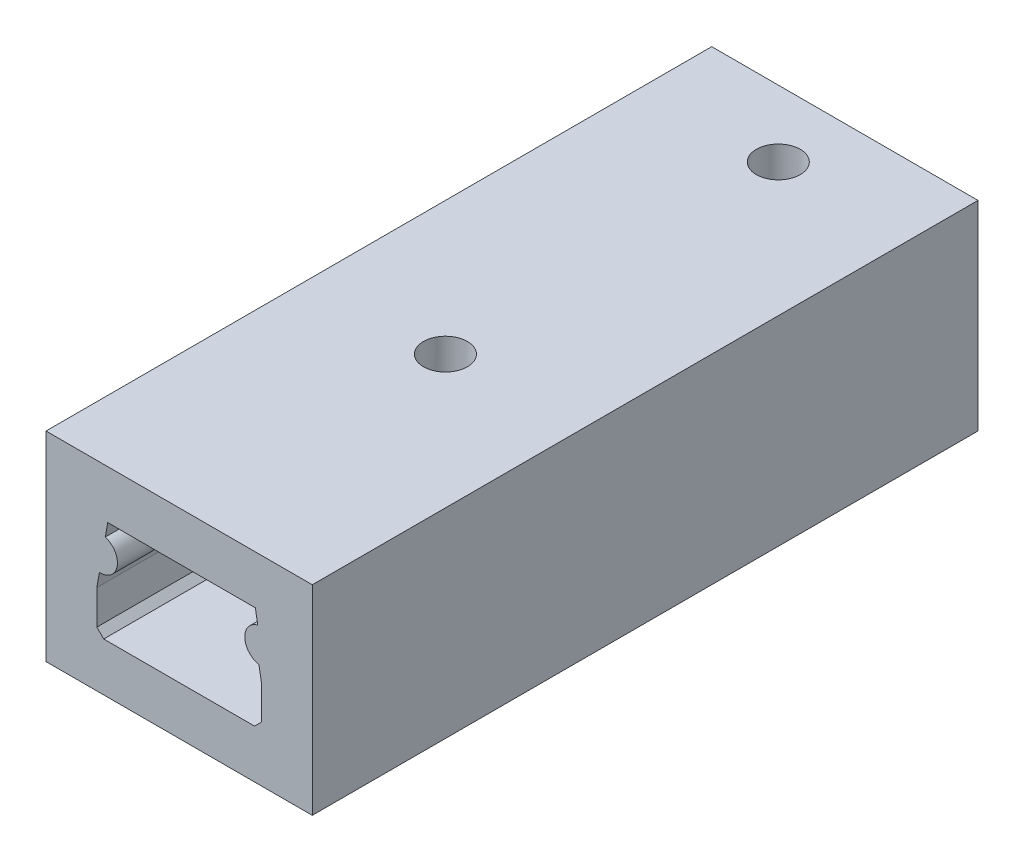
ISO-10303-21;
HEADER;
FILE_DESCRIPTION(('STEP AP214'),'2;1');
FILE_NAME('part.step','',(''),(''),'','','');
FILE_SCHEMA(('AUTOMOTIVE_DESIGN { 1 0 10303 214 1 1 1 1 }'));
ENDSEC;
DATA;
#1=APPLICATION_CONTEXT('core data for automotive mechanical design processes');
#2=APPLICATION_PROTOCOL_DEFINITION('international standard','automotive_design',2000,#1);
#3=PRODUCT_CONTEXT('',#1,'mechanical');
#4=PRODUCT('Part','Part','',(#3));
#5=PRODUCT_RELATED_PRODUCT_CATEGORY('part','',(#4));
#6=PRODUCT_DEFINITION_FORMATION('','',#4);
#7=PRODUCT_DEFINITION_CONTEXT('part definition',#1,'design');
#8=PRODUCT_DEFINITION('design','',#6,#7);
#9=PRODUCT_DEFINITION_SHAPE('','',#8);
#10=(LENGTH_UNIT() NAMED_UNIT(*) SI_UNIT(.MILLI.,.METRE.));
#11=(NAMED_UNIT(*) PLANE_ANGLE_UNIT() SI_UNIT($,.RADIAN.));
#12=(NAMED_UNIT(*) SI_UNIT($,.STERADIAN.) SOLID_ANGLE_UNIT());
#13=UNCERTAINTY_MEASURE_WITH_UNIT(LENGTH_MEASURE(1.E-05),#10,'distance_accuracy_value','');
#14=(GEOMETRIC_REPRESENTATION_CONTEXT(3) GLOBAL_UNCERTAINTY_ASSIGNED_CONTEXT((#13)) GLOBAL_UNIT_ASSIGNED_CONTEXT((#10,
#11,#12)) REPRESENTATION_CONTEXT('',''));
#15=CARTESIAN_POINT('',(0.,0.,0.));
#16=DIRECTION('',(0.,0.,1.));
#17=DIRECTION('',(1.,0.,0.));
#18=AXIS2_PLACEMENT_3D('',#15,#16,#17);
#19=CARTESIAN_POINT('',(0.,0.,50.));
#20=DIRECTION('',(0.,0.,-1.));
#21=DIRECTION('',(-1.,0.,0.));
#22=AXIS2_PLACEMENT_3D('',#19,#20,#21);
#23=PLANE('',#22);
#24=DIRECTION('',(0.,1.,0.));
#25=VECTOR('',#24,1.);
#26=CARTESIAN_POINT('',(10.,-3.75,50.));
#27=LINE('',#26,#25);
#28=CARTESIAN_POINT('',(10.,-3.75,50.));
#29=VERTEX_POINT('',#28);
#30=CARTESIAN_POINT('',(10.,11.25,50.));
#31=VERTEX_POINT('',#30);
#32=EDGE_CURVE('E292',#29,#31,#27,.T.);
#33=ORIENTED_EDGE('',*,*,#32,.T.);
#34=DIRECTION('',(-1.,0.,0.));
#35=VECTOR('',#34,1.);
#36=CARTESIAN_POINT('',(-10.,11.25,50.));
#37=LINE('',#36,#35);
#38=CARTESIAN_POINT('',(-10.,11.25,50.));
#39=VERTEX_POINT('',#38);
#40=EDGE_CURVE('E296',#31,#39,#37,.T.);
#41=ORIENTED_EDGE('',*,*,#40,.T.);
#42=DIRECTION('',(0.,-1.,0.));
#43=VECTOR('',#42,1.);
#44=CARTESIAN_POINT('',(-10.,-3.75,50.));
#45=LINE('',#44,#43);
#46=CARTESIAN_POINT('',(-10.,-3.75,50.));
#47=VERTEX_POINT('',#46);
#48=EDGE_CURVE('E300',#39,#47,#45,.T.);
#49=ORIENTED_EDGE('',*,*,#48,.T.);
#50=DIRECTION('',(1.,0.,0.));
#51=VECTOR('',#50,1.);
#52=CARTESIAN_POINT('',(-10.,-3.75,50.));
#53=LINE('',#52,#51);
#54=EDGE_CURVE('E303',#47,#29,#53,.T.);
#55=ORIENTED_EDGE('',*,*,#54,.T.);
#56=EDGE_LOOP('',(#33,#41,#49,#55));
#57=FACE_BOUND('',#56,.T.);
#58=DIRECTION('',(0.707106781186548,0.707106781186547,0.));
#59=VECTOR('',#58,1.);
#60=CARTESIAN_POINT('',(5.665,-0.1125,50.));
#61=LINE('',#60,#59);
#62=CARTESIAN_POINT('',(5.665,-0.1125,50.));
#63=VERTEX_POINT('',#62);
#64=CARTESIAN_POINT('',(6.18,0.4025,50.));
#65=VERTEX_POINT('',#64);
#66=EDGE_CURVE('E161',#63,#65,#61,.T.);
#67=ORIENTED_EDGE('',*,*,#66,.F.);
#68=DIRECTION('',(1.,0.,0.));
#69=VECTOR('',#68,1.);
#70=CARTESIAN_POINT('',(-5.665,-0.1125,50.));
#71=LINE('',#70,#69);
#72=CARTESIAN_POINT('',(-5.665,-0.1125,50.));
#73=VERTEX_POINT('',#72);
#74=EDGE_CURVE('E215',#73,#63,#71,.T.);
#75=ORIENTED_EDGE('',*,*,#74,.F.);
#76=DIRECTION('',(0.707106781186548,-0.707106781186547,0.));
#77=VECTOR('',#76,1.);
#78=CARTESIAN_POINT('',(-6.18,0.4025,50.));
#79=LINE('',#78,#77);
#80=CARTESIAN_POINT('',(-6.18,0.4025,50.));
#81=VERTEX_POINT('',#80);
#82=EDGE_CURVE('E212',#81,#73,#79,.T.);
#83=ORIENTED_EDGE('',*,*,#82,.F.);
#84=DIRECTION('',(0.,-1.,0.));
#85=VECTOR('',#84,1.);
#86=CARTESIAN_POINT('',(-6.18,2.9775,50.));
#87=LINE('',#86,#85);
#88=CARTESIAN_POINT('',(-6.18,2.9775,50.));
#89=VERTEX_POINT('',#88);
#90=EDGE_CURVE('E209',#89,#81,#87,.T.);
#91=ORIENTED_EDGE('',*,*,#90,.F.);
#92=DIRECTION('',(-0.173648177666919,-0.98480775301221,0.));
#93=VECTOR('',#92,1.);
#94=CARTESIAN_POINT('',(-5.98899935383237,4.0607184921458,50.));
#95=LINE('',#94,#93);
#96=CARTESIAN_POINT('',(-5.98899935383237,4.06071849214581,50.));
#97=VERTEX_POINT('',#96);
#98=EDGE_CURVE('E206',#97,#89,#95,.T.);
#99=ORIENTED_EDGE('',*,*,#98,.F.);
#100=CARTESIAN_POINT('',(-5.92249999999993,5.3465,50.));
#101=DIRECTION('',(0.,0.,-1.));
#102=DIRECTION('',(1.,0.,0.));
#103=AXIS2_PLACEMENT_3D('',#100,#101,#102);
#104=CIRCLE('',#103,1.28749999999997);
#105=CARTESIAN_POINT('',(-5.54522577648146,6.57748351340237,50.));
#106=VERTEX_POINT('',#105);
#107=EDGE_CURVE('E203',#106,#97,#104,.T.);
#108=ORIENTED_EDGE('',*,*,#107,.F.);
#109=DIRECTION('',(-0.17364817766689,-0.984807753012215,0.));
#110=VECTOR('',#109,1.);
#111=CARTESIAN_POINT('',(-5.36272444441626,7.6125,50.));
#112=LINE('',#111,#110);
#113=CARTESIAN_POINT('',(-5.36272444441626,7.6125,50.));
#114=VERTEX_POINT('',#113);
#115=EDGE_CURVE('E200',#114,#106,#112,.T.);
#116=ORIENTED_EDGE('',*,*,#115,.F.);
#117=DIRECTION('',(-1.,0.,0.));
#118=VECTOR('',#117,1.);
#119=CARTESIAN_POINT('',(5.72272444441626,7.6125,50.));
#120=LINE('',#119,#118);
#121=CARTESIAN_POINT('',(5.72272444441626,7.6125,50.));
#122=VERTEX_POINT('',#121);
#123=EDGE_CURVE('E197',#122,#114,#120,.T.);
#124=ORIENTED_EDGE('',*,*,#123,.F.);
#125=DIRECTION('',(-0.173648177666889,0.984807753012215,0.));
#126=VECTOR('',#125,1.);
#127=CARTESIAN_POINT('',(5.90522577648145,6.57748351340238,50.));
#128=LINE('',#127,#126);
#129=CARTESIAN_POINT('',(5.90522577648145,6.57748351340238,50.));
#130=VERTEX_POINT('',#129);
#131=EDGE_CURVE('E194',#130,#122,#128,.T.);
#132=ORIENTED_EDGE('',*,*,#131,.F.);
#133=CARTESIAN_POINT('',(6.21599005199749,5.32805091615556,50.));
#134=DIRECTION('',(0.,0.,-1.));
#135=DIRECTION('',(1.,0.,0.));
#136=AXIS2_PLACEMENT_3D('',#133,#134,#135);
#137=CIRCLE('',#136,1.28749999999998);
#138=CARTESIAN_POINT('',(5.98899935383237,4.06071849214579,50.));
#139=VERTEX_POINT('',#138);
#140=EDGE_CURVE('E188',#139,#130,#137,.T.);
#141=ORIENTED_EDGE('',*,*,#140,.F.);
#142=DIRECTION('',(-0.17364817766692,0.98480775301221,0.));
#143=VECTOR('',#142,1.);
#144=CARTESIAN_POINT('',(6.18,2.9775,50.));
#145=LINE('',#144,#143);
#146=CARTESIAN_POINT('',(6.18,2.9775,50.));
#147=VERTEX_POINT('',#146);
#148=EDGE_CURVE('E184',#147,#139,#145,.T.);
#149=ORIENTED_EDGE('',*,*,#148,.F.);
#150=DIRECTION('',(0.,1.,0.));
#151=VECTOR('',#150,1.);
#152=CARTESIAN_POINT('',(6.18,0.4025,50.));
#153=LINE('',#152,#151);
#154=EDGE_CURVE('E170',#65,#147,#153,.T.);
#155=ORIENTED_EDGE('',*,*,#154,.F.);
#156=EDGE_LOOP('',(#67,#75,#83,#91,#99,#108,#116,#124,#132,#141,#149,#155));
#157=FACE_BOUND('',#156,.T.);
#158=ADVANCED_FACE('F45',(#57,#157),#23,.F.);
#159=CARTESIAN_POINT('',(0.,0.,0.));
#160=DIRECTION('',(0.,0.,-1.));
#161=DIRECTION('',(-1.,0.,0.));
#162=AXIS2_PLACEMENT_3D('',#159,#160,#161);
#163=PLANE('',#162);
#164=DIRECTION('',(0.,1.,0.));
#165=VECTOR('',#164,1.);
#166=CARTESIAN_POINT('',(10.,-3.75,0.));
#167=LINE('',#166,#165);
#168=CARTESIAN_POINT('',(10.,-3.75,0.));
#169=VERTEX_POINT('',#168);
#170=CARTESIAN_POINT('',(10.,11.25,0.));
#171=VERTEX_POINT('',#170);
#172=EDGE_CURVE('E179',#169,#171,#167,.T.);
#173=ORIENTED_EDGE('',*,*,#172,.F.);
#174=DIRECTION('',(1.,0.,0.));
#175=VECTOR('',#174,1.);
#176=CARTESIAN_POINT('',(-10.,-3.75,0.));
#177=LINE('',#176,#175);
#178=CARTESIAN_POINT('',(-10.,-3.75,0.));
#179=VERTEX_POINT('',#178);
#180=EDGE_CURVE('E297',#179,#169,#177,.T.);
#181=ORIENTED_EDGE('',*,*,#180,.F.);
#182=DIRECTION('',(0.,-1.,0.));
#183=VECTOR('',#182,1.);
#184=CARTESIAN_POINT('',(-10.,-3.75,0.));
#185=LINE('',#184,#183);
#186=CARTESIAN_POINT('',(-10.,11.25,0.));
#187=VERTEX_POINT('',#186);
#188=EDGE_CURVE('E313',#187,#179,#185,.T.);
#189=ORIENTED_EDGE('',*,*,#188,.F.);
#190=DIRECTION('',(-1.,0.,0.));
#191=VECTOR('',#190,1.);
#192=CARTESIAN_POINT('',(-10.,11.25,0.));
#193=LINE('',#192,#191);
#194=EDGE_CURVE('E310',#171,#187,#193,.T.);
#195=ORIENTED_EDGE('',*,*,#194,.F.);
#196=EDGE_LOOP('',(#173,#181,#189,#195));
#197=FACE_BOUND('',#196,.T.);
#198=DIRECTION('',(1.,0.,0.));
#199=VECTOR('',#198,1.);
#200=CARTESIAN_POINT('',(-5.665,-0.1125,0.));
#201=LINE('',#200,#199);
#202=CARTESIAN_POINT('',(-5.665,-0.1125,0.));
#203=VERTEX_POINT('',#202);
#204=CARTESIAN_POINT('',(5.665,-0.1125,0.));
#205=VERTEX_POINT('',#204);
#206=EDGE_CURVE('E171',#203,#205,#201,.T.);
#207=ORIENTED_EDGE('',*,*,#206,.T.);
#208=DIRECTION('',(0.707106781186548,0.707106781186547,0.));
#209=VECTOR('',#208,1.);
#210=CARTESIAN_POINT('',(5.665,-0.1125,0.));
#211=LINE('',#210,#209);
#212=CARTESIAN_POINT('',(6.18,0.4025,0.));
#213=VERTEX_POINT('',#212);
#214=EDGE_CURVE('E71',#205,#213,#211,.T.);
#215=ORIENTED_EDGE('',*,*,#214,.T.);
#216=DIRECTION('',(0.,1.,0.));
#217=VECTOR('',#216,1.);
#218=CARTESIAN_POINT('',(6.18,0.4025,0.));
#219=LINE('',#218,#217);
#220=CARTESIAN_POINT('',(6.18,2.9775,0.));
#221=VERTEX_POINT('',#220);
#222=EDGE_CURVE('E177',#213,#221,#219,.T.);
#223=ORIENTED_EDGE('',*,*,#222,.T.);
#224=DIRECTION('',(-0.17364817766692,0.98480775301221,0.));
#225=VECTOR('',#224,1.);
#226=CARTESIAN_POINT('',(6.18,2.9775,0.));
#227=LINE('',#226,#225);
#228=CARTESIAN_POINT('',(5.98899935383237,4.06071849214579,0.));
#229=VERTEX_POINT('',#228);
#230=EDGE_CURVE('E223',#221,#229,#227,.T.);
#231=ORIENTED_EDGE('',*,*,#230,.T.);
#232=CARTESIAN_POINT('',(6.21599005199749,5.32805091615556,0.));
#233=DIRECTION('',(0.,0.,-1.));
#234=DIRECTION('',(1.,0.,0.));
#235=AXIS2_PLACEMENT_3D('',#232,#233,#234);
#236=CIRCLE('',#235,1.28749999999998);
#237=CARTESIAN_POINT('',(5.90522577648145,6.57748351340238,0.));
#238=VERTEX_POINT('',#237);
#239=EDGE_CURVE('E227',#229,#238,#236,.T.);
#240=ORIENTED_EDGE('',*,*,#239,.T.);
#241=DIRECTION('',(-0.173648177666889,0.984807753012215,0.));
#242=VECTOR('',#241,1.);
#243=CARTESIAN_POINT('',(5.90522577648145,6.57748351340238,0.));
#244=LINE('',#243,#242);
#245=CARTESIAN_POINT('',(5.72272444441626,7.6125,0.));
#246=VERTEX_POINT('',#245);
#247=EDGE_CURVE('E231',#238,#246,#244,.T.);
#248=ORIENTED_EDGE('',*,*,#247,.T.);
#249=DIRECTION('',(-1.,0.,0.));
#250=VECTOR('',#249,1.);
#251=CARTESIAN_POINT('',(5.72272444441626,7.6125,0.));
#252=LINE('',#251,#250);
#253=CARTESIAN_POINT('',(-5.36272444441626,7.6125,0.));
#254=VERTEX_POINT('',#253);
#255=EDGE_CURVE('E235',#246,#254,#252,.T.);
#256=ORIENTED_EDGE('',*,*,#255,.T.);
#257=DIRECTION('',(-0.17364817766689,-0.984807753012215,0.));
#258=VECTOR('',#257,1.);
#259=CARTESIAN_POINT('',(-5.36272444441626,7.6125,0.));
#260=LINE('',#259,#258);
#261=CARTESIAN_POINT('',(-5.54522577648146,6.57748351340237,0.));
#262=VERTEX_POINT('',#261);
#263=EDGE_CURVE('E239',#254,#262,#260,.T.);
#264=ORIENTED_EDGE('',*,*,#263,.T.);
#265=CARTESIAN_POINT('',(-5.92249999999993,5.3465,0.));
#266=DIRECTION('',(0.,0.,-1.));
#267=DIRECTION('',(1.,0.,0.));
#268=AXIS2_PLACEMENT_3D('',#265,#266,#267);
#269=CIRCLE('',#268,1.28749999999997);
#270=CARTESIAN_POINT('',(-5.98899935383237,4.06071849214581,0.));
#271=VERTEX_POINT('',#270);
#272=EDGE_CURVE('E243',#262,#271,#269,.T.);
#273=ORIENTED_EDGE('',*,*,#272,.T.);
#274=DIRECTION('',(-0.173648177666919,-0.98480775301221,0.));
#275=VECTOR('',#274,1.);
#276=CARTESIAN_POINT('',(-5.98899935383237,4.0607184921458,0.));
#277=LINE('',#276,#275);
#278=CARTESIAN_POINT('',(-6.18,2.9775,0.));
#279=VERTEX_POINT('',#278);
#280=EDGE_CURVE('E247',#271,#279,#277,.T.);
#281=ORIENTED_EDGE('',*,*,#280,.T.);
#282=DIRECTION('',(0.,-1.,0.));
#283=VECTOR('',#282,1.);
#284=CARTESIAN_POINT('',(-6.18,2.9775,0.));
#285=LINE('',#284,#283);
#286=CARTESIAN_POINT('',(-6.18,0.4025,0.));
#287=VERTEX_POINT('',#286);
#288=EDGE_CURVE('E251',#279,#287,#285,.T.);
#289=ORIENTED_EDGE('',*,*,#288,.T.);
#290=DIRECTION('',(0.707106781186548,-0.707106781186547,0.));
#291=VECTOR('',#290,1.);
#292=CARTESIAN_POINT('',(-6.18,0.4025,0.));
#293=LINE('',#292,#291);
#294=EDGE_CURVE('E255',#287,#203,#293,.T.);
#295=ORIENTED_EDGE('',*,*,#294,.T.);
#296=EDGE_LOOP('',(#207,#215,#223,#231,#240,#248,#256,#264,#273,#281,#289,#295));
#297=FACE_BOUND('',#296,.T.);
#298=ADVANCED_FACE('F373',(#197,#297),#163,.T.);
#299=CARTESIAN_POINT('',(10.,-3.75,50.));
#300=DIRECTION('',(-1.,0.,0.));
#301=DIRECTION('',(0.,0.,1.));
#302=AXIS2_PLACEMENT_3D('',#299,#300,#301);
#303=PLANE('',#302);
#304=ORIENTED_EDGE('',*,*,#172,.T.);
#305=DIRECTION('',(0.,0.,-1.));
#306=VECTOR('',#305,1.);
#307=CARTESIAN_POINT('',(10.,11.25,50.));
#308=LINE('',#307,#306);
#309=EDGE_CURVE('E11',#31,#171,#308,.T.);
#310=ORIENTED_EDGE('',*,*,#309,.F.);
#311=ORIENTED_EDGE('',*,*,#32,.F.);
#312=DIRECTION('',(0.,0.,-1.));
#313=VECTOR('',#312,1.);
#314=CARTESIAN_POINT('',(10.,-3.75,50.));
#315=LINE('',#314,#313);
#316=EDGE_CURVE('E306',#29,#169,#315,.T.);
#317=ORIENTED_EDGE('',*,*,#316,.T.);
#318=EDGE_LOOP('',(#304,#310,#311,#317));
#319=FACE_BOUND('',#318,.T.);
#320=ADVANCED_FACE('F47',(#319),#303,.F.);
#321=CARTESIAN_POINT('',(-10.,11.25,50.));
#322=DIRECTION('',(0.,-1.,0.));
#323=DIRECTION('',(0.,0.,-1.));
#324=AXIS2_PLACEMENT_3D('',#321,#322,#323);
#325=PLANE('',#324);
#326=CARTESIAN_POINT('',(0.,11.25,5.));
#327=DIRECTION('',(0.,1.,0.));
#328=DIRECTION('',(0.,0.,1.));
#329=AXIS2_PLACEMENT_3D('',#326,#327,#328);
#330=CIRCLE('',#329,1.65);
#331=CARTESIAN_POINT('',(0.,11.25,6.65));
#332=VERTEX_POINT('',#331);
#333=EDGE_CURVE('E339',#332,#332,#330,.T.);
#334=ORIENTED_EDGE('',*,*,#333,.F.);
#335=EDGE_LOOP('',(#334));
#336=FACE_BOUND('',#335,.T.);
#337=CARTESIAN_POINT('',(0.,11.25,30.));
#338=DIRECTION('',(0.,1.,0.));
#339=DIRECTION('',(0.,0.,1.));
#340=AXIS2_PLACEMENT_3D('',#337,#338,#339);
#341=CIRCLE('',#340,1.65);
#342=CARTESIAN_POINT('',(0.,11.25,31.65));
#343=VERTEX_POINT('',#342);
#344=EDGE_CURVE('E345',#343,#343,#341,.T.);
#345=ORIENTED_EDGE('',*,*,#344,.F.);
#346=EDGE_LOOP('',(#345));
#347=FACE_BOUND('',#346,.T.);
#348=ORIENTED_EDGE('',*,*,#194,.T.);
#349=DIRECTION('',(0.,0.,-1.));
#350=VECTOR('',#349,1.);
#351=CARTESIAN_POINT('',(-10.,11.25,50.));
#352=LINE('',#351,#350);
#353=EDGE_CURVE('E55',#39,#187,#352,.T.);
#354=ORIENTED_EDGE('',*,*,#353,.F.);
#355=ORIENTED_EDGE('',*,*,#40,.F.);
#356=ORIENTED_EDGE('',*,*,#309,.T.);
#357=EDGE_LOOP('',(#348,#354,#355,#356));
#358=FACE_BOUND('',#357,.T.);
#359=ADVANCED_FACE('F437',(#336,#347,#358),#325,.F.);
#360=CARTESIAN_POINT('',(-10.,-3.75,50.));
#361=DIRECTION('',(1.,0.,0.));
#362=DIRECTION('',(0.,0.,-1.));
#363=AXIS2_PLACEMENT_3D('',#360,#361,#362);
#364=PLANE('',#363);
#365=ORIENTED_EDGE('',*,*,#188,.T.);
#366=DIRECTION('',(0.,0.,-1.));
#367=VECTOR('',#366,1.);
#368=CARTESIAN_POINT('',(-10.,-3.75,50.));
#369=LINE('',#368,#367);
#370=EDGE_CURVE('E321',#47,#179,#369,.T.);
#371=ORIENTED_EDGE('',*,*,#370,.F.);
#372=ORIENTED_EDGE('',*,*,#48,.F.);
#373=ORIENTED_EDGE('',*,*,#353,.T.);
#374=EDGE_LOOP('',(#365,#371,#372,#373));
#375=FACE_BOUND('',#374,.T.);
#376=ADVANCED_FACE('F435',(#375),#364,.F.);
#377=CARTESIAN_POINT('',(-10.,-3.75,50.));
#378=DIRECTION('',(0.,1.,0.));
#379=DIRECTION('',(0.,0.,1.));
#380=AXIS2_PLACEMENT_3D('',#377,#378,#379);
#381=PLANE('',#380);
#382=CARTESIAN_POINT('',(0.,-3.75,5.));
#383=DIRECTION('',(0.,1.,0.));
#384=DIRECTION('',(0.,0.,1.));
#385=AXIS2_PLACEMENT_3D('',#382,#383,#384);
#386=CIRCLE('',#385,1.65);
#387=CARTESIAN_POINT('',(0.,-3.75,6.65));
#388=VERTEX_POINT('',#387);
#389=EDGE_CURVE('E331',#388,#388,#386,.T.);
#390=ORIENTED_EDGE('',*,*,#389,.T.);
#391=EDGE_LOOP('',(#390));
#392=FACE_BOUND('',#391,.T.);
#393=CARTESIAN_POINT('',(0.,-3.75,30.));
#394=DIRECTION('',(0.,1.,0.));
#395=DIRECTION('',(0.,0.,1.));
#396=AXIS2_PLACEMENT_3D('',#393,#394,#395);
#397=CIRCLE('',#396,1.65);
#398=CARTESIAN_POINT('',(0.,-3.75,31.65));
#399=VERTEX_POINT('',#398);
#400=EDGE_CURVE('E351',#399,#399,#397,.T.);
#401=ORIENTED_EDGE('',*,*,#400,.T.);
#402=EDGE_LOOP('',(#401));
#403=FACE_BOUND('',#402,.T.);
#404=ORIENTED_EDGE('',*,*,#180,.T.);
#405=ORIENTED_EDGE('',*,*,#316,.F.);
#406=ORIENTED_EDGE('',*,*,#54,.F.);
#407=ORIENTED_EDGE('',*,*,#370,.T.);
#408=EDGE_LOOP('',(#404,#405,#406,#407));
#409=FACE_BOUND('',#408,.T.);
#410=ADVANCED_FACE('F432',(#392,#403,#409),#381,.F.);
#411=CARTESIAN_POINT('',(5.665,-0.1125,50.));
#412=DIRECTION('',(-0.707106781186547,0.707106781186548,0.));
#413=DIRECTION('',(-0.707106781186548,-0.707106781186547,0.));
#414=AXIS2_PLACEMENT_3D('',#411,#412,#413);
#415=PLANE('',#414);
#416=ORIENTED_EDGE('',*,*,#214,.F.);
#417=DIRECTION('',(0.,0.,-1.));
#418=VECTOR('',#417,1.);
#419=CARTESIAN_POINT('',(5.665,-0.1125,50.));
#420=LINE('',#419,#418);
#421=EDGE_CURVE('E165',#63,#205,#420,.T.);
#422=ORIENTED_EDGE('',*,*,#421,.F.);
#423=ORIENTED_EDGE('',*,*,#66,.T.);
#424=DIRECTION('',(0.,0.,-1.));
#425=VECTOR('',#424,1.);
#426=CARTESIAN_POINT('',(6.18,0.4025,50.));
#427=LINE('',#426,#425);
#428=EDGE_CURVE('E164',#65,#213,#427,.T.);
#429=ORIENTED_EDGE('',*,*,#428,.T.);
#430=EDGE_LOOP('',(#416,#422,#423,#429));
#431=FACE_BOUND('',#430,.T.);
#432=ADVANCED_FACE('F163',(#431),#415,.T.);
#433=CARTESIAN_POINT('',(6.18,0.4025,50.));
#434=DIRECTION('',(-1.,0.,0.));
#435=DIRECTION('',(0.,0.,1.));
#436=AXIS2_PLACEMENT_3D('',#433,#434,#435);
#437=PLANE('',#436);
#438=ORIENTED_EDGE('',*,*,#222,.F.);
#439=ORIENTED_EDGE('',*,*,#428,.F.);
#440=ORIENTED_EDGE('',*,*,#154,.T.);
#441=DIRECTION('',(0.,0.,-1.));
#442=VECTOR('',#441,1.);
#443=CARTESIAN_POINT('',(6.18,2.9775,50.));
#444=LINE('',#443,#442);
#445=EDGE_CURVE('E180',#147,#221,#444,.T.);
#446=ORIENTED_EDGE('',*,*,#445,.T.);
#447=EDGE_LOOP('',(#438,#439,#440,#446));
#448=FACE_BOUND('',#447,.T.);
#449=ADVANCED_FACE('F174',(#448),#437,.T.);
#450=CARTESIAN_POINT('',(6.18,2.9775,50.));
#451=DIRECTION('',(-0.98480775301221,-0.17364817766692,0.));
#452=DIRECTION('',(0.17364817766692,-0.98480775301221,0.));
#453=AXIS2_PLACEMENT_3D('',#450,#451,#452);
#454=PLANE('',#453);
#455=ORIENTED_EDGE('',*,*,#230,.F.);
#456=ORIENTED_EDGE('',*,*,#445,.F.);
#457=ORIENTED_EDGE('',*,*,#148,.T.);
#458=DIRECTION('',(0.,0.,-1.));
#459=VECTOR('',#458,1.);
#460=CARTESIAN_POINT('',(5.98899935383237,4.06071849214579,50.));
#461=LINE('',#460,#459);
#462=EDGE_CURVE('E287',#139,#229,#461,.T.);
#463=ORIENTED_EDGE('',*,*,#462,.T.);
#464=EDGE_LOOP('',(#455,#456,#457,#463));
#465=FACE_BOUND('',#464,.T.);
#466=ADVANCED_FACE('F413',(#465),#454,.T.);
#467=CARTESIAN_POINT('',(6.21599005199749,5.32805091615556,50.));
#468=DIRECTION('',(0.,0.,-1.));
#469=DIRECTION('',(-1.,0.,0.));
#470=AXIS2_PLACEMENT_3D('',#467,#468,#469);
#471=CYLINDRICAL_SURFACE('',#470,1.28749999999998);
#472=ORIENTED_EDGE('',*,*,#239,.F.);
#473=ORIENTED_EDGE('',*,*,#462,.F.);
#474=ORIENTED_EDGE('',*,*,#140,.T.);
#475=DIRECTION('',(0.,0.,-1.));
#476=VECTOR('',#475,1.);
#477=CARTESIAN_POINT('',(5.90522577648145,6.57748351340238,50.));
#478=LINE('',#477,#476);
#479=EDGE_CURVE('E284',#130,#238,#478,.T.);
#480=ORIENTED_EDGE('',*,*,#479,.T.);
#481=EDGE_LOOP('',(#472,#473,#474,#480));
#482=FACE_BOUND('',#481,.T.);
#483=ADVANCED_FACE('F410',(#482),#471,.T.);
#484=CARTESIAN_POINT('',(5.90522577648145,6.57748351340238,50.));
#485=DIRECTION('',(-0.984807753012215,-0.173648177666889,0.));
#486=DIRECTION('',(0.173648177666889,-0.984807753012215,0.));
#487=AXIS2_PLACEMENT_3D('',#484,#485,#486);
#488=PLANE('',#487);
#489=ORIENTED_EDGE('',*,*,#247,.F.);
#490=ORIENTED_EDGE('',*,*,#479,.F.);
#491=ORIENTED_EDGE('',*,*,#131,.T.);
#492=DIRECTION('',(0.,0.,-1.));
#493=VECTOR('',#492,1.);
#494=CARTESIAN_POINT('',(5.72272444441626,7.6125,50.));
#495=LINE('',#494,#493);
#496=EDGE_CURVE('E281',#122,#246,#495,.T.);
#497=ORIENTED_EDGE('',*,*,#496,.T.);
#498=EDGE_LOOP('',(#489,#490,#491,#497));
#499=FACE_BOUND('',#498,.T.);
#500=ADVANCED_FACE('F405',(#499),#488,.T.);
#501=CARTESIAN_POINT('',(5.72272444441626,7.6125,50.));
#502=DIRECTION('',(0.,-1.,0.));
#503=DIRECTION('',(0.,0.,-1.));
#504=AXIS2_PLACEMENT_3D('',#501,#502,#503);
#505=PLANE('',#504);
#506=CARTESIAN_POINT('',(0.,7.6125,5.));
#507=DIRECTION('',(0.,-1.,0.));
#508=DIRECTION('',(0.,0.,-1.));
#509=AXIS2_PLACEMENT_3D('',#506,#507,#508);
#510=CIRCLE('',#509,1.65);
#511=CARTESIAN_POINT('',(0.,7.6125,3.35));
#512=VERTEX_POINT('',#511);
#513=EDGE_CURVE('E220',#512,#512,#510,.T.);
#514=ORIENTED_EDGE('',*,*,#513,.F.);
#515=EDGE_LOOP('',(#514));
#516=FACE_BOUND('',#515,.T.);
#517=CARTESIAN_POINT('',(0.,7.6125,30.));
#518=DIRECTION('',(0.,-1.,0.));
#519=DIRECTION('',(0.,0.,-1.));
#520=AXIS2_PLACEMENT_3D('',#517,#518,#519);
#521=CIRCLE('',#520,1.65);
#522=CARTESIAN_POINT('',(0.,7.6125,28.35));
#523=VERTEX_POINT('',#522);
#524=EDGE_CURVE('E330',#523,#523,#521,.T.);
#525=ORIENTED_EDGE('',*,*,#524,.F.);
#526=EDGE_LOOP('',(#525));
#527=FACE_BOUND('',#526,.T.);
#528=ORIENTED_EDGE('',*,*,#255,.F.);
#529=ORIENTED_EDGE('',*,*,#496,.F.);
#530=ORIENTED_EDGE('',*,*,#123,.T.);
#531=DIRECTION('',(0.,0.,-1.));
#532=VECTOR('',#531,1.);
#533=CARTESIAN_POINT('',(-5.36272444441626,7.6125,50.));
#534=LINE('',#533,#532);
#535=EDGE_CURVE('E278',#114,#254,#534,.T.);
#536=ORIENTED_EDGE('',*,*,#535,.T.);
#537=EDGE_LOOP('',(#528,#529,#530,#536));
#538=FACE_BOUND('',#537,.T.);
#539=ADVANCED_FACE('F401',(#516,#527,#538),#505,.T.);
#540=CARTESIAN_POINT('',(-5.36272444441626,7.6125,50.));
#541=DIRECTION('',(0.984807753012215,-0.17364817766689,0.));
#542=DIRECTION('',(0.17364817766689,0.984807753012215,0.));
#543=AXIS2_PLACEMENT_3D('',#540,#541,#542);
#544=PLANE('',#543);
#545=ORIENTED_EDGE('',*,*,#263,.F.);
#546=ORIENTED_EDGE('',*,*,#535,.F.);
#547=ORIENTED_EDGE('',*,*,#115,.T.);
#548=DIRECTION('',(0.,0.,-1.));
#549=VECTOR('',#548,1.);
#550=CARTESIAN_POINT('',(-5.54522577648146,6.57748351340237,50.));
#551=LINE('',#550,#549);
#552=EDGE_CURVE('E275',#106,#262,#551,.T.);
#553=ORIENTED_EDGE('',*,*,#552,.T.);
#554=EDGE_LOOP('',(#545,#546,#547,#553));
#555=FACE_BOUND('',#554,.T.);
#556=ADVANCED_FACE('F398',(#555),#544,.T.);
#557=CARTESIAN_POINT('',(-5.92249999999993,5.3465,50.));
#558=DIRECTION('',(0.,0.,-1.));
#559=DIRECTION('',(-1.,0.,0.));
#560=AXIS2_PLACEMENT_3D('',#557,#558,#559);
#561=CYLINDRICAL_SURFACE('',#560,1.28749999999997);
#562=ORIENTED_EDGE('',*,*,#272,.F.);
#563=ORIENTED_EDGE('',*,*,#552,.F.);
#564=ORIENTED_EDGE('',*,*,#107,.T.);
#565=DIRECTION('',(0.,0.,-1.));
#566=VECTOR('',#565,1.);
#567=CARTESIAN_POINT('',(-5.98899935383237,4.06071849214581,50.));
#568=LINE('',#567,#566);
#569=EDGE_CURVE('E272',#97,#271,#568,.T.);
#570=ORIENTED_EDGE('',*,*,#569,.T.);
#571=EDGE_LOOP('',(#562,#563,#564,#570));
#572=FACE_BOUND('',#571,.T.);
#573=ADVANCED_FACE('F390',(#572),#561,.T.);
#574=CARTESIAN_POINT('',(-5.98899935383237,4.0607184921458,50.));
#575=DIRECTION('',(0.98480775301221,-0.173648177666919,0.));
#576=DIRECTION('',(0.173648177666919,0.98480775301221,0.));
#577=AXIS2_PLACEMENT_3D('',#574,#575,#576);
#578=PLANE('',#577);
#579=ORIENTED_EDGE('',*,*,#280,.F.);
#580=ORIENTED_EDGE('',*,*,#569,.F.);
#581=ORIENTED_EDGE('',*,*,#98,.T.);
#582=DIRECTION('',(0.,0.,-1.));
#583=VECTOR('',#582,1.);
#584=CARTESIAN_POINT('',(-6.18,2.9775,50.));
#585=LINE('',#584,#583);
#586=EDGE_CURVE('E269',#89,#279,#585,.T.);
#587=ORIENTED_EDGE('',*,*,#586,.T.);
#588=EDGE_LOOP('',(#579,#580,#581,#587));
#589=FACE_BOUND('',#588,.T.);
#590=ADVANCED_FACE('F386',(#589),#578,.T.);
#591=CARTESIAN_POINT('',(-6.18,2.9775,50.));
#592=DIRECTION('',(1.,0.,0.));
#593=DIRECTION('',(0.,0.,-1.));
#594=AXIS2_PLACEMENT_3D('',#591,#592,#593);
#595=PLANE('',#594);
#596=ORIENTED_EDGE('',*,*,#288,.F.);
#597=ORIENTED_EDGE('',*,*,#586,.F.);
#598=ORIENTED_EDGE('',*,*,#90,.T.);
#599=DIRECTION('',(0.,0.,-1.));
#600=VECTOR('',#599,1.);
#601=CARTESIAN_POINT('',(-6.18,0.4025,50.));
#602=LINE('',#601,#600);
#603=EDGE_CURVE('E266',#81,#287,#602,.T.);
#604=ORIENTED_EDGE('',*,*,#603,.T.);
#605=EDGE_LOOP('',(#596,#597,#598,#604));
#606=FACE_BOUND('',#605,.T.);
#607=ADVANCED_FACE('F383',(#606),#595,.T.);
#608=CARTESIAN_POINT('',(-6.18,0.4025,50.));
#609=DIRECTION('',(0.707106781186547,0.707106781186548,0.));
#610=DIRECTION('',(-0.707106781186548,0.707106781186547,0.));
#611=AXIS2_PLACEMENT_3D('',#608,#609,#610);
#612=PLANE('',#611);
#613=ORIENTED_EDGE('',*,*,#294,.F.);
#614=ORIENTED_EDGE('',*,*,#603,.F.);
#615=ORIENTED_EDGE('',*,*,#82,.T.);
#616=DIRECTION('',(0.,0.,-1.));
#617=VECTOR('',#616,1.);
#618=CARTESIAN_POINT('',(-5.665,-0.1125,50.));
#619=LINE('',#618,#617);
#620=EDGE_CURVE('E63',#73,#203,#619,.T.);
#621=ORIENTED_EDGE('',*,*,#620,.T.);
#622=EDGE_LOOP('',(#613,#614,#615,#621));
#623=FACE_BOUND('',#622,.T.);
#624=ADVANCED_FACE('F369',(#623),#612,.T.);
#625=CARTESIAN_POINT('',(-5.665,-0.1125,50.));
#626=DIRECTION('',(0.,1.,0.));
#627=DIRECTION('',(0.,0.,1.));
#628=AXIS2_PLACEMENT_3D('',#625,#626,#627);
#629=PLANE('',#628);
#630=CARTESIAN_POINT('',(0.,-0.1125,5.));
#631=DIRECTION('',(0.,1.,0.));
#632=DIRECTION('',(0.,0.,1.));
#633=AXIS2_PLACEMENT_3D('',#630,#631,#632);
#634=CIRCLE('',#633,1.65);
#635=CARTESIAN_POINT('',(0.,-0.1125,6.65));
#636=VERTEX_POINT('',#635);
#637=EDGE_CURVE('E49',#636,#636,#634,.T.);
#638=ORIENTED_EDGE('',*,*,#637,.F.);
#639=EDGE_LOOP('',(#638));
#640=FACE_BOUND('',#639,.T.);
#641=CARTESIAN_POINT('',(0.,-0.1125,30.));
#642=DIRECTION('',(0.,1.,0.));
#643=DIRECTION('',(0.,0.,1.));
#644=AXIS2_PLACEMENT_3D('',#641,#642,#643);
#645=CIRCLE('',#644,1.65);
#646=CARTESIAN_POINT('',(0.,-0.1125,31.65));
#647=VERTEX_POINT('',#646);
#648=EDGE_CURVE('E327',#647,#647,#645,.T.);
#649=ORIENTED_EDGE('',*,*,#648,.F.);
#650=EDGE_LOOP('',(#649));
#651=FACE_BOUND('',#650,.T.);
#652=ORIENTED_EDGE('',*,*,#206,.F.);
#653=ORIENTED_EDGE('',*,*,#620,.F.);
#654=ORIENTED_EDGE('',*,*,#74,.T.);
#655=ORIENTED_EDGE('',*,*,#421,.T.);
#656=EDGE_LOOP('',(#652,#653,#654,#655));
#657=FACE_BOUND('',#656,.T.);
#658=ADVANCED_FACE('F365',(#640,#651,#657),#629,.T.);
#659=CARTESIAN_POINT('',(0.,-3.75,30.));
#660=DIRECTION('',(0.,1.,0.));
#661=DIRECTION('',(0.,0.,1.));
#662=AXIS2_PLACEMENT_3D('',#659,#660,#661);
#663=CYLINDRICAL_SURFACE('',#662,1.65);
#664=ORIENTED_EDGE('',*,*,#648,.T.);
#665=EDGE_LOOP('',(#664));
#666=FACE_BOUND('',#665,.T.);
#667=ORIENTED_EDGE('',*,*,#400,.F.);
#668=EDGE_LOOP('',(#667));
#669=FACE_BOUND('',#668,.T.);
#670=ADVANCED_FACE('F368',(#666,#669),#663,.F.);
#671=CARTESIAN_POINT('',(0.,-3.75,5.));
#672=DIRECTION('',(0.,1.,0.));
#673=DIRECTION('',(0.,0.,1.));
#674=AXIS2_PLACEMENT_3D('',#671,#672,#673);
#675=CYLINDRICAL_SURFACE('',#674,1.65);
#676=ORIENTED_EDGE('',*,*,#637,.T.);
#677=EDGE_LOOP('',(#676));
#678=FACE_BOUND('',#677,.T.);
#679=ORIENTED_EDGE('',*,*,#389,.F.);
#680=EDGE_LOOP('',(#679));
#681=FACE_BOUND('',#680,.T.);
#682=ADVANCED_FACE('F362',(#678,#681),#675,.F.);
#683=ORIENTED_EDGE('',*,*,#524,.T.);
#684=EDGE_LOOP('',(#683));
#685=FACE_BOUND('',#684,.T.);
#686=ORIENTED_EDGE('',*,*,#344,.T.);
#687=EDGE_LOOP('',(#686));
#688=FACE_BOUND('',#687,.T.);
#689=ADVANCED_FACE('F462',(#685,#688),#663,.F.);
#690=ORIENTED_EDGE('',*,*,#513,.T.);
#691=EDGE_LOOP('',(#690));
#692=FACE_BOUND('',#691,.T.);
#693=ORIENTED_EDGE('',*,*,#333,.T.);
#694=EDGE_LOOP('',(#693));
#695=FACE_BOUND('',#694,.T.);
#696=ADVANCED_FACE('F464',(#692,#695),#675,.F.);
#697=CLOSED_SHELL('',(#158,#298,#320,#359,#376,#410,#432,#449,#466,#483,#500,#539,#556,#573,
#590,#607,#624,#658,#670,#682,#689,#696));
#698=MANIFOLD_SOLID_BREP('B2',#697);
#699=ADVANCED_BREP_SHAPE_REPRESENTATION('',(#18,#698),#14);
#700=SHAPE_DEFINITION_REPRESENTATION(#9,#699);
ENDSEC;
END-ISO-10303-21;
